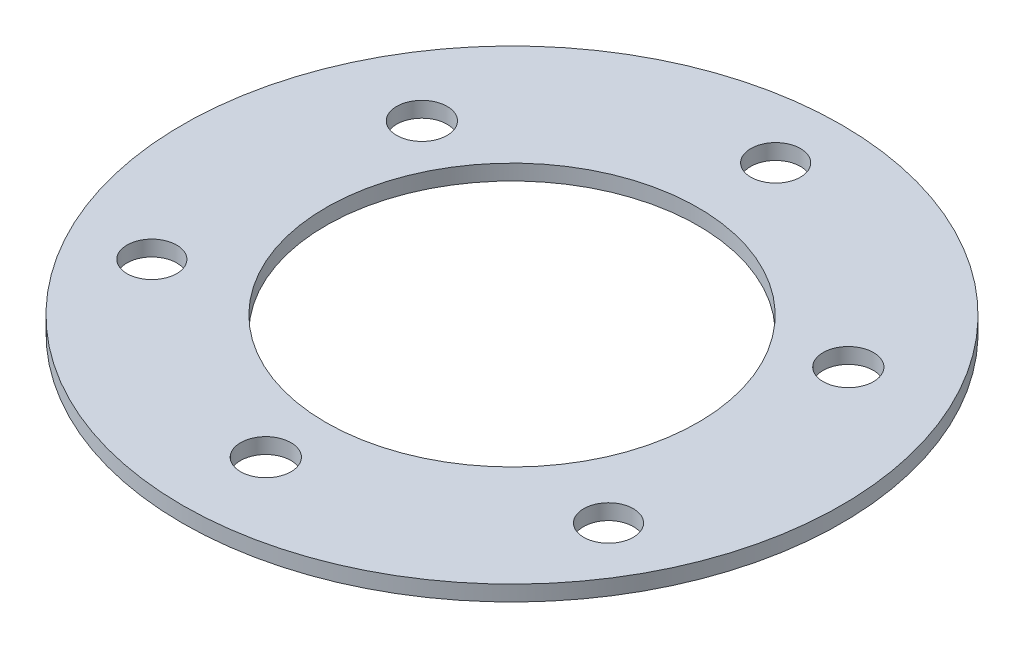
ISO-10303-21;
HEADER;
FILE_DESCRIPTION(('STEP AP214'),'2;1');
FILE_NAME('part.step','',(''),(''),'','','');
FILE_SCHEMA(('AUTOMOTIVE_DESIGN { 1 0 10303 214 1 1 1 1 }'));
ENDSEC;
DATA;
#1=APPLICATION_CONTEXT('core data for automotive mechanical design processes');
#2=APPLICATION_PROTOCOL_DEFINITION('international standard','automotive_design',2000,#1);
#3=PRODUCT_CONTEXT('',#1,'mechanical');
#4=PRODUCT('Part','Part','',(#3));
#5=PRODUCT_RELATED_PRODUCT_CATEGORY('part','',(#4));
#6=PRODUCT_DEFINITION_FORMATION('','',#4);
#7=PRODUCT_DEFINITION_CONTEXT('part definition',#1,'design');
#8=PRODUCT_DEFINITION('design','',#6,#7);
#9=PRODUCT_DEFINITION_SHAPE('','',#8);
#10=(LENGTH_UNIT() NAMED_UNIT(*) SI_UNIT(.MILLI.,.METRE.));
#11=(NAMED_UNIT(*) PLANE_ANGLE_UNIT() SI_UNIT($,.RADIAN.));
#12=(NAMED_UNIT(*) SI_UNIT($,.STERADIAN.) SOLID_ANGLE_UNIT());
#13=UNCERTAINTY_MEASURE_WITH_UNIT(LENGTH_MEASURE(1.E-05),#10,'distance_accuracy_value','');
#14=(GEOMETRIC_REPRESENTATION_CONTEXT(3) GLOBAL_UNCERTAINTY_ASSIGNED_CONTEXT((#13)) GLOBAL_UNIT_ASSIGNED_CONTEXT((#10,
#11,#12)) REPRESENTATION_CONTEXT('',''));
#15=CARTESIAN_POINT('',(0.,0.,0.));
#16=DIRECTION('',(0.,0.,1.));
#17=DIRECTION('',(1.,0.,0.));
#18=AXIS2_PLACEMENT_3D('',#15,#16,#17);
#19=CARTESIAN_POINT('',(0.,2.,0.));
#20=DIRECTION('',(0.,1.,0.));
#21=DIRECTION('',(0.,0.,1.));
#22=AXIS2_PLACEMENT_3D('',#19,#20,#21);
#23=PLANE('',#22);
#24=CARTESIAN_POINT('',(0.,2.,31.75));
#25=DIRECTION('',(0.,1.,0.));
#26=DIRECTION('',(0.,0.,1.));
#27=AXIS2_PLACEMENT_3D('',#24,#25,#26);
#28=CIRCLE('',#27,3.25);
#29=CARTESIAN_POINT('',(0.,2.,35.));
#30=VERTEX_POINT('',#29);
#31=EDGE_CURVE('E68',#30,#30,#28,.T.);
#32=ORIENTED_EDGE('',*,*,#31,.F.);
#33=EDGE_LOOP('',(#32));
#34=FACE_BOUND('',#33,.T.);
#35=CARTESIAN_POINT('',(-29.4448637286688,2.,17.0000000000012));
#36=DIRECTION('',(0.,1.,0.));
#37=DIRECTION('',(0.,0.,1.));
#38=AXIS2_PLACEMENT_3D('',#35,#36,#37);
#39=CIRCLE('',#38,3.2);
#40=CARTESIAN_POINT('',(-29.4448637286688,2.,20.2000000000012));
#41=VERTEX_POINT('',#40);
#42=EDGE_CURVE('E95',#41,#41,#39,.T.);
#43=ORIENTED_EDGE('',*,*,#42,.F.);
#44=EDGE_LOOP('',(#43));
#45=FACE_BOUND('',#44,.T.);
#46=CARTESIAN_POINT('',(-27.4963065701559,2.,-15.8750000000001));
#47=DIRECTION('',(0.,1.,0.));
#48=DIRECTION('',(0.,0.,1.));
#49=AXIS2_PLACEMENT_3D('',#46,#47,#48);
#50=CIRCLE('',#49,3.25);
#51=CARTESIAN_POINT('',(-27.4963065701559,2.,-12.6250000000001));
#52=VERTEX_POINT('',#51);
#53=EDGE_CURVE('E89',#52,#52,#50,.T.);
#54=ORIENTED_EDGE('',*,*,#53,.F.);
#55=EDGE_LOOP('',(#54));
#56=FACE_BOUND('',#55,.T.);
#57=CARTESIAN_POINT('',(0.,2.,-34.));
#58=DIRECTION('',(0.,1.,0.));
#59=DIRECTION('',(0.,0.,1.));
#60=AXIS2_PLACEMENT_3D('',#57,#58,#59);
#61=CIRCLE('',#60,3.2);
#62=CARTESIAN_POINT('',(0.,2.,-30.8));
#63=VERTEX_POINT('',#62);
#64=EDGE_CURVE('E80',#63,#63,#61,.T.);
#65=ORIENTED_EDGE('',*,*,#64,.F.);
#66=EDGE_LOOP('',(#65));
#67=FACE_BOUND('',#66,.T.);
#68=CARTESIAN_POINT('',(27.4963065701561,2.,-15.8749999999997));
#69=DIRECTION('',(0.,1.,0.));
#70=DIRECTION('',(0.,0.,1.));
#71=AXIS2_PLACEMENT_3D('',#68,#69,#70);
#72=CIRCLE('',#71,3.25);
#73=CARTESIAN_POINT('',(27.4963065701561,2.,-12.6249999999997));
#74=VERTEX_POINT('',#73);
#75=EDGE_CURVE('E73',#74,#74,#72,.T.);
#76=ORIENTED_EDGE('',*,*,#75,.F.);
#77=EDGE_LOOP('',(#76));
#78=FACE_BOUND('',#77,.T.);
#79=CARTESIAN_POINT('',(29.4448637286731,2.,16.9999999999987));
#80=DIRECTION('',(0.,1.,0.));
#81=DIRECTION('',(0.,0.,1.));
#82=AXIS2_PLACEMENT_3D('',#79,#80,#81);
#83=CIRCLE('',#82,3.2);
#84=CARTESIAN_POINT('',(29.4448637286731,2.,20.1999999999987));
#85=VERTEX_POINT('',#84);
#86=EDGE_CURVE('E63',#85,#85,#83,.T.);
#87=ORIENTED_EDGE('',*,*,#86,.F.);
#88=EDGE_LOOP('',(#87));
#89=FACE_BOUND('',#88,.T.);
#90=CARTESIAN_POINT('',(0.,2.,0.));
#91=DIRECTION('',(0.,1.,0.));
#92=DIRECTION('',(0.,0.,1.));
#93=AXIS2_PLACEMENT_3D('',#90,#91,#92);
#94=CIRCLE('',#93,42.5);
#95=CARTESIAN_POINT('',(0.,2.,42.5));
#96=VERTEX_POINT('',#95);
#97=EDGE_CURVE('E11',#96,#96,#94,.T.);
#98=ORIENTED_EDGE('',*,*,#97,.T.);
#99=EDGE_LOOP('',(#98));
#100=FACE_BOUND('',#99,.T.);
#101=CARTESIAN_POINT('',(0.,2.,0.));
#102=DIRECTION('',(0.,1.,0.));
#103=DIRECTION('',(0.,0.,1.));
#104=AXIS2_PLACEMENT_3D('',#101,#102,#103);
#105=CIRCLE('',#104,24.);
#106=CARTESIAN_POINT('',(0.,2.,24.));
#107=VERTEX_POINT('',#106);
#108=EDGE_CURVE('E54',#107,#107,#105,.T.);
#109=ORIENTED_EDGE('',*,*,#108,.F.);
#110=EDGE_LOOP('',(#109));
#111=FACE_BOUND('',#110,.T.);
#112=ADVANCED_FACE('F43',(#34,#45,#56,#67,#78,#89,#100,#111),#23,.T.);
#113=CARTESIAN_POINT('',(0.,0.,0.));
#114=DIRECTION('',(0.,1.,0.));
#115=DIRECTION('',(0.,0.,1.));
#116=AXIS2_PLACEMENT_3D('',#113,#114,#115);
#117=PLANE('',#116);
#118=CARTESIAN_POINT('',(0.,0.,31.75));
#119=DIRECTION('',(0.,1.,0.));
#120=DIRECTION('',(0.,0.,1.));
#121=AXIS2_PLACEMENT_3D('',#118,#119,#120);
#122=CIRCLE('',#121,3.25);
#123=CARTESIAN_POINT('',(0.,0.,35.));
#124=VERTEX_POINT('',#123);
#125=EDGE_CURVE('E101',#124,#124,#122,.T.);
#126=ORIENTED_EDGE('',*,*,#125,.T.);
#127=EDGE_LOOP('',(#126));
#128=FACE_BOUND('',#127,.T.);
#129=CARTESIAN_POINT('',(-29.4448637286688,0.,17.0000000000012));
#130=DIRECTION('',(0.,1.,0.));
#131=DIRECTION('',(0.,0.,1.));
#132=AXIS2_PLACEMENT_3D('',#129,#130,#131);
#133=CIRCLE('',#132,3.2);
#134=CARTESIAN_POINT('',(-29.4448637286688,0.,20.2000000000012));
#135=VERTEX_POINT('',#134);
#136=EDGE_CURVE('E70',#135,#135,#133,.T.);
#137=ORIENTED_EDGE('',*,*,#136,.T.);
#138=EDGE_LOOP('',(#137));
#139=FACE_BOUND('',#138,.T.);
#140=CARTESIAN_POINT('',(-27.4963065701559,0.,-15.8750000000001));
#141=DIRECTION('',(0.,1.,0.));
#142=DIRECTION('',(0.,0.,1.));
#143=AXIS2_PLACEMENT_3D('',#140,#141,#142);
#144=CIRCLE('',#143,3.25);
#145=CARTESIAN_POINT('',(-27.4963065701559,0.,-12.6250000000001));
#146=VERTEX_POINT('',#145);
#147=EDGE_CURVE('E93',#146,#146,#144,.T.);
#148=ORIENTED_EDGE('',*,*,#147,.T.);
#149=EDGE_LOOP('',(#148));
#150=FACE_BOUND('',#149,.T.);
#151=CARTESIAN_POINT('',(0.,0.,-34.));
#152=DIRECTION('',(0.,1.,0.));
#153=DIRECTION('',(0.,0.,1.));
#154=AXIS2_PLACEMENT_3D('',#151,#152,#153);
#155=CIRCLE('',#154,3.2);
#156=CARTESIAN_POINT('',(0.,0.,-30.8));
#157=VERTEX_POINT('',#156);
#158=EDGE_CURVE('E84',#157,#157,#155,.T.);
#159=ORIENTED_EDGE('',*,*,#158,.T.);
#160=EDGE_LOOP('',(#159));
#161=FACE_BOUND('',#160,.T.);
#162=CARTESIAN_POINT('',(27.4963065701561,0.,-15.8749999999997));
#163=DIRECTION('',(0.,1.,0.));
#164=DIRECTION('',(0.,0.,1.));
#165=AXIS2_PLACEMENT_3D('',#162,#163,#164);
#166=CIRCLE('',#165,3.25);
#167=CARTESIAN_POINT('',(27.4963065701561,0.,-12.6249999999997));
#168=VERTEX_POINT('',#167);
#169=EDGE_CURVE('E77',#168,#168,#166,.T.);
#170=ORIENTED_EDGE('',*,*,#169,.T.);
#171=EDGE_LOOP('',(#170));
#172=FACE_BOUND('',#171,.T.);
#173=CARTESIAN_POINT('',(29.4448637286731,0.,16.9999999999987));
#174=DIRECTION('',(0.,1.,0.));
#175=DIRECTION('',(0.,0.,1.));
#176=AXIS2_PLACEMENT_3D('',#173,#174,#175);
#177=CIRCLE('',#176,3.2);
#178=CARTESIAN_POINT('',(29.4448637286731,0.,20.1999999999987));
#179=VERTEX_POINT('',#178);
#180=EDGE_CURVE('E69',#179,#179,#177,.T.);
#181=ORIENTED_EDGE('',*,*,#180,.T.);
#182=EDGE_LOOP('',(#181));
#183=FACE_BOUND('',#182,.T.);
#184=CARTESIAN_POINT('',(0.,0.,0.));
#185=DIRECTION('',(0.,1.,0.));
#186=DIRECTION('',(0.,0.,1.));
#187=AXIS2_PLACEMENT_3D('',#184,#185,#186);
#188=CIRCLE('',#187,42.5);
#189=CARTESIAN_POINT('',(0.,0.,42.5));
#190=VERTEX_POINT('',#189);
#191=EDGE_CURVE('E47',#190,#190,#188,.T.);
#192=ORIENTED_EDGE('',*,*,#191,.F.);
#193=EDGE_LOOP('',(#192));
#194=FACE_BOUND('',#193,.T.);
#195=CARTESIAN_POINT('',(0.,0.,0.));
#196=DIRECTION('',(0.,1.,0.));
#197=DIRECTION('',(0.,0.,1.));
#198=AXIS2_PLACEMENT_3D('',#195,#196,#197);
#199=CIRCLE('',#198,24.);
#200=CARTESIAN_POINT('',(0.,0.,24.));
#201=VERTEX_POINT('',#200);
#202=EDGE_CURVE('E57',#201,#201,#199,.T.);
#203=ORIENTED_EDGE('',*,*,#202,.T.);
#204=EDGE_LOOP('',(#203));
#205=FACE_BOUND('',#204,.T.);
#206=ADVANCED_FACE('F118',(#128,#139,#150,#161,#172,#183,#194,#205),#117,.F.);
#207=CARTESIAN_POINT('',(0.,2.,0.));
#208=DIRECTION('',(0.,-1.,0.));
#209=DIRECTION('',(0.,0.,-1.));
#210=AXIS2_PLACEMENT_3D('',#207,#208,#209);
#211=CYLINDRICAL_SURFACE('',#210,42.5);
#212=ORIENTED_EDGE('',*,*,#97,.F.);
#213=EDGE_LOOP('',(#212));
#214=FACE_BOUND('',#213,.T.);
#215=ORIENTED_EDGE('',*,*,#191,.T.);
#216=EDGE_LOOP('',(#215));
#217=FACE_BOUND('',#216,.T.);
#218=ADVANCED_FACE('F45',(#214,#217),#211,.T.);
#219=CARTESIAN_POINT('',(0.,2.,0.));
#220=DIRECTION('',(0.,-1.,0.));
#221=DIRECTION('',(0.,0.,-1.));
#222=AXIS2_PLACEMENT_3D('',#219,#220,#221);
#223=CYLINDRICAL_SURFACE('',#222,24.);
#224=ORIENTED_EDGE('',*,*,#108,.T.);
#225=EDGE_LOOP('',(#224));
#226=FACE_BOUND('',#225,.T.);
#227=ORIENTED_EDGE('',*,*,#202,.F.);
#228=EDGE_LOOP('',(#227));
#229=FACE_BOUND('',#228,.T.);
#230=ADVANCED_FACE('F146',(#226,#229),#223,.F.);
#231=CARTESIAN_POINT('',(29.4448637286731,0.,16.9999999999987));
#232=DIRECTION('',(0.,1.,0.));
#233=DIRECTION('',(0.,0.,1.));
#234=AXIS2_PLACEMENT_3D('',#231,#232,#233);
#235=CYLINDRICAL_SURFACE('',#234,3.2);
#236=ORIENTED_EDGE('',*,*,#180,.F.);
#237=EDGE_LOOP('',(#236));
#238=FACE_BOUND('',#237,.T.);
#239=ORIENTED_EDGE('',*,*,#86,.T.);
#240=EDGE_LOOP('',(#239));
#241=FACE_BOUND('',#240,.T.);
#242=ADVANCED_FACE('F147',(#238,#241),#235,.F.);
#243=CARTESIAN_POINT('',(27.4963065701561,0.,-15.8749999999997));
#244=DIRECTION('',(0.,1.,0.));
#245=DIRECTION('',(0.,0.,1.));
#246=AXIS2_PLACEMENT_3D('',#243,#244,#245);
#247=CYLINDRICAL_SURFACE('',#246,3.25);
#248=ORIENTED_EDGE('',*,*,#169,.F.);
#249=EDGE_LOOP('',(#248));
#250=FACE_BOUND('',#249,.T.);
#251=ORIENTED_EDGE('',*,*,#75,.T.);
#252=EDGE_LOOP('',(#251));
#253=FACE_BOUND('',#252,.T.);
#254=ADVANCED_FACE('F151',(#250,#253),#247,.F.);
#255=CARTESIAN_POINT('',(0.,0.,-34.));
#256=DIRECTION('',(0.,1.,0.));
#257=DIRECTION('',(0.,0.,1.));
#258=AXIS2_PLACEMENT_3D('',#255,#256,#257);
#259=CYLINDRICAL_SURFACE('',#258,3.2);
#260=ORIENTED_EDGE('',*,*,#158,.F.);
#261=EDGE_LOOP('',(#260));
#262=FACE_BOUND('',#261,.T.);
#263=ORIENTED_EDGE('',*,*,#64,.T.);
#264=EDGE_LOOP('',(#263));
#265=FACE_BOUND('',#264,.T.);
#266=ADVANCED_FACE('F132',(#262,#265),#259,.F.);
#267=CARTESIAN_POINT('',(-27.4963065701559,0.,-15.8750000000001));
#268=DIRECTION('',(0.,1.,0.));
#269=DIRECTION('',(0.,0.,1.));
#270=AXIS2_PLACEMENT_3D('',#267,#268,#269);
#271=CYLINDRICAL_SURFACE('',#270,3.25);
#272=ORIENTED_EDGE('',*,*,#147,.F.);
#273=EDGE_LOOP('',(#272));
#274=FACE_BOUND('',#273,.T.);
#275=ORIENTED_EDGE('',*,*,#53,.T.);
#276=EDGE_LOOP('',(#275));
#277=FACE_BOUND('',#276,.T.);
#278=ADVANCED_FACE('F124',(#274,#277),#271,.F.);
#279=CARTESIAN_POINT('',(-29.4448637286688,0.,17.0000000000012));
#280=DIRECTION('',(0.,1.,0.));
#281=DIRECTION('',(0.,0.,1.));
#282=AXIS2_PLACEMENT_3D('',#279,#280,#281);
#283=CYLINDRICAL_SURFACE('',#282,3.2);
#284=ORIENTED_EDGE('',*,*,#136,.F.);
#285=EDGE_LOOP('',(#284));
#286=FACE_BOUND('',#285,.T.);
#287=ORIENTED_EDGE('',*,*,#42,.T.);
#288=EDGE_LOOP('',(#287));
#289=FACE_BOUND('',#288,.T.);
#290=ADVANCED_FACE('F121',(#286,#289),#283,.F.);
#291=CARTESIAN_POINT('',(0.,0.,31.75));
#292=DIRECTION('',(0.,1.,0.));
#293=DIRECTION('',(0.,0.,1.));
#294=AXIS2_PLACEMENT_3D('',#291,#292,#293);
#295=CYLINDRICAL_SURFACE('',#294,3.25);
#296=ORIENTED_EDGE('',*,*,#125,.F.);
#297=EDGE_LOOP('',(#296));
#298=FACE_BOUND('',#297,.T.);
#299=ORIENTED_EDGE('',*,*,#31,.T.);
#300=EDGE_LOOP('',(#299));
#301=FACE_BOUND('',#300,.T.);
#302=ADVANCED_FACE('F123',(#298,#301),#295,.F.);
#303=CLOSED_SHELL('',(#112,#206,#218,#230,#242,#254,#266,#278,#290,#302));
#304=MANIFOLD_SOLID_BREP('B2',#303);
#305=ADVANCED_BREP_SHAPE_REPRESENTATION('',(#18,#304),#14);
#306=SHAPE_DEFINITION_REPRESENTATION(#9,#305);
ENDSEC;
END-ISO-10303-21;
